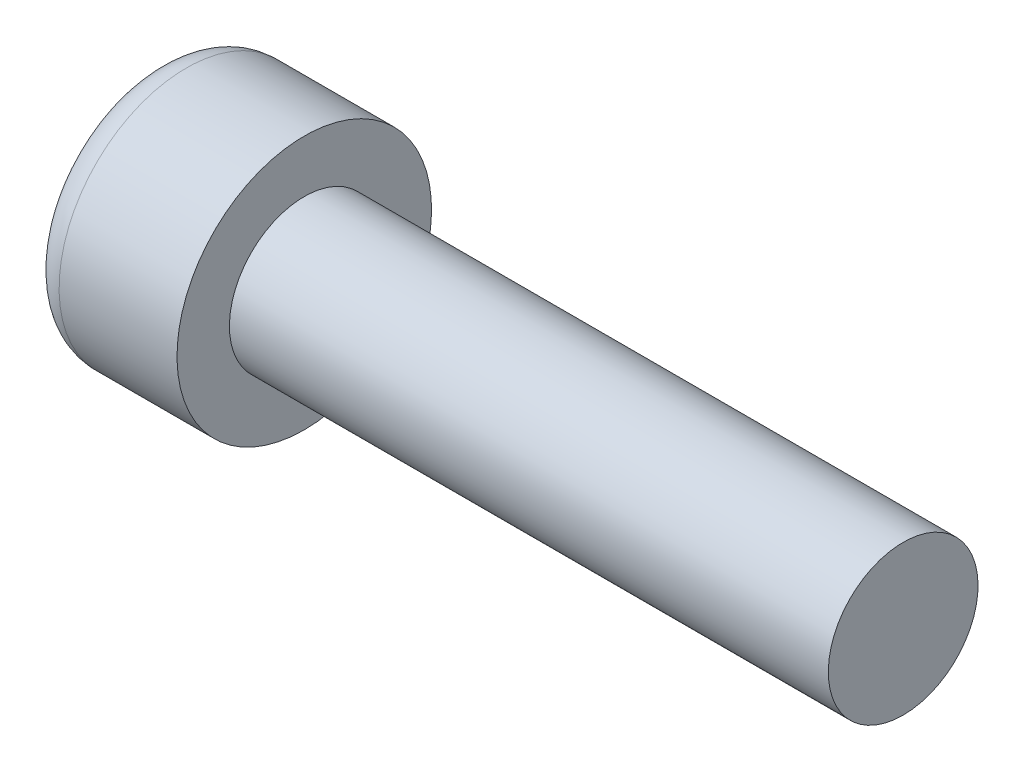
ISO-10303-21;
HEADER;
FILE_DESCRIPTION(('STEP AP214'),'2;1');
FILE_NAME('part.step','',(''),(''),'','','');
FILE_SCHEMA(('AUTOMOTIVE_DESIGN { 1 0 10303 214 1 1 1 1 }'));
ENDSEC;
DATA;
#1=APPLICATION_CONTEXT('core data for automotive mechanical design processes');
#2=APPLICATION_PROTOCOL_DEFINITION('international standard','automotive_design',2000,#1);
#3=PRODUCT_CONTEXT('',#1,'mechanical');
#4=PRODUCT('Part','Part','',(#3));
#5=PRODUCT_RELATED_PRODUCT_CATEGORY('part','',(#4));
#6=PRODUCT_DEFINITION_FORMATION('','',#4);
#7=PRODUCT_DEFINITION_CONTEXT('part definition',#1,'design');
#8=PRODUCT_DEFINITION('design','',#6,#7);
#9=PRODUCT_DEFINITION_SHAPE('','',#8);
#10=(LENGTH_UNIT() NAMED_UNIT(*) SI_UNIT(.MILLI.,.METRE.));
#11=(NAMED_UNIT(*) PLANE_ANGLE_UNIT() SI_UNIT($,.RADIAN.));
#12=(NAMED_UNIT(*) SI_UNIT($,.STERADIAN.) SOLID_ANGLE_UNIT());
#13=UNCERTAINTY_MEASURE_WITH_UNIT(LENGTH_MEASURE(1.E-05),#10,'distance_accuracy_value','');
#14=(GEOMETRIC_REPRESENTATION_CONTEXT(3) GLOBAL_UNCERTAINTY_ASSIGNED_CONTEXT((#13)) GLOBAL_UNIT_ASSIGNED_CONTEXT((#10,
#11,#12)) REPRESENTATION_CONTEXT('',''));
#15=CARTESIAN_POINT('',(0.,0.,0.));
#16=DIRECTION('',(0.,0.,1.));
#17=DIRECTION('',(1.,0.,0.));
#18=AXIS2_PLACEMENT_3D('',#15,#16,#17);
#19=CARTESIAN_POINT('',(0.,0.,0.));
#20=DIRECTION('',(1.,0.,0.));
#21=DIRECTION('',(0.,1.,0.));
#22=AXIS2_PLACEMENT_3D('',#19,#20,#21);
#23=PLANE('',#22);
#24=DIRECTION('',(0.,-0.5,-0.866025403784439));
#25=VECTOR('',#24,1.);
#26=CARTESIAN_POINT('',(0.,2.3094010767585,0.));
#27=LINE('',#26,#25);
#28=CARTESIAN_POINT('',(0.,2.3094010767585,0.));
#29=VERTEX_POINT('',#28);
#30=CARTESIAN_POINT('',(0.,1.15470053837925,-2.));
#31=VERTEX_POINT('',#30);
#32=EDGE_CURVE('E121',#29,#31,#27,.T.);
#33=ORIENTED_EDGE('',*,*,#32,.F.);
#34=DIRECTION('',(0.,0.5,-0.866025403784439));
#35=VECTOR('',#34,1.);
#36=CARTESIAN_POINT('',(0.,1.15470053837925,2.));
#37=LINE('',#36,#35);
#38=CARTESIAN_POINT('',(0.,1.15470053837925,2.));
#39=VERTEX_POINT('',#38);
#40=EDGE_CURVE('E47',#39,#29,#37,.T.);
#41=ORIENTED_EDGE('',*,*,#40,.F.);
#42=DIRECTION('',(0.,1.,0.));
#43=VECTOR('',#42,1.);
#44=CARTESIAN_POINT('',(0.,-1.15470053837925,2.));
#45=LINE('',#44,#43);
#46=CARTESIAN_POINT('',(0.,-1.15470053837925,2.));
#47=VERTEX_POINT('',#46);
#48=EDGE_CURVE('E130',#47,#39,#45,.T.);
#49=ORIENTED_EDGE('',*,*,#48,.F.);
#50=DIRECTION('',(0.,0.5,0.866025403784439));
#51=VECTOR('',#50,1.);
#52=CARTESIAN_POINT('',(0.,-2.3094010767585,0.));
#53=LINE('',#52,#51);
#54=CARTESIAN_POINT('',(0.,-2.3094010767585,0.));
#55=VERTEX_POINT('',#54);
#56=EDGE_CURVE('E128',#55,#47,#53,.T.);
#57=ORIENTED_EDGE('',*,*,#56,.F.);
#58=DIRECTION('',(0.,-0.5,0.866025403784439));
#59=VECTOR('',#58,1.);
#60=CARTESIAN_POINT('',(0.,-1.15470053837925,-2.));
#61=LINE('',#60,#59);
#62=CARTESIAN_POINT('',(0.,-1.15470053837925,-2.));
#63=VERTEX_POINT('',#62);
#64=EDGE_CURVE('E95',#63,#55,#61,.T.);
#65=ORIENTED_EDGE('',*,*,#64,.F.);
#66=DIRECTION('',(0.,-1.,0.));
#67=VECTOR('',#66,1.);
#68=CARTESIAN_POINT('',(0.,1.15470053837925,-2.));
#69=LINE('',#68,#67);
#70=EDGE_CURVE('E124',#31,#63,#69,.T.);
#71=ORIENTED_EDGE('',*,*,#70,.F.);
#72=EDGE_LOOP('',(#33,#41,#49,#57,#65,#71));
#73=FACE_BOUND('',#72,.T.);
#74=CARTESIAN_POINT('',(0.,0.,0.));
#75=DIRECTION('',(-1.,0.,0.));
#76=DIRECTION('',(0.,-1.,0.));
#77=AXIS2_PLACEMENT_3D('',#74,#75,#76);
#78=CIRCLE('',#77,3.1875);
#79=CARTESIAN_POINT('',(0.,-3.1875,0.));
#80=VERTEX_POINT('',#79);
#81=EDGE_CURVE('E11',#80,#80,#78,.T.);
#82=ORIENTED_EDGE('',*,*,#81,.T.);
#83=EDGE_LOOP('',(#82));
#84=FACE_BOUND('',#83,.T.);
#85=ADVANCED_FACE('F33',(#73,#84),#23,.F.);
#86=CARTESIAN_POINT('',(1.0625,0.,0.));
#87=DIRECTION('',(-1.,0.,0.));
#88=DIRECTION('',(0.,-1.,0.));
#89=AXIS2_PLACEMENT_3D('',#86,#87,#88);
#90=TOROIDAL_SURFACE('',#89,3.1875,1.0625);
#91=ORIENTED_EDGE('',*,*,#81,.F.);
#92=EDGE_LOOP('',(#91));
#93=FACE_BOUND('',#92,.T.);
#94=CARTESIAN_POINT('',(1.0625,0.,0.));
#95=DIRECTION('',(-1.,0.,0.));
#96=DIRECTION('',(0.,-1.,0.));
#97=AXIS2_PLACEMENT_3D('',#94,#95,#96);
#98=CIRCLE('',#97,4.25);
#99=CARTESIAN_POINT('',(1.0625,-4.25,0.));
#100=VERTEX_POINT('',#99);
#101=EDGE_CURVE('E40',#100,#100,#98,.T.);
#102=ORIENTED_EDGE('',*,*,#101,.T.);
#103=EDGE_LOOP('',(#102));
#104=FACE_BOUND('',#103,.T.);
#105=ADVANCED_FACE('F150',(#93,#104),#90,.T.);
#106=CARTESIAN_POINT('',(0.,0.,0.));
#107=DIRECTION('',(-1.,0.,0.));
#108=DIRECTION('',(0.,-1.,0.));
#109=AXIS2_PLACEMENT_3D('',#106,#107,#108);
#110=CYLINDRICAL_SURFACE('',#109,4.25);
#111=ORIENTED_EDGE('',*,*,#101,.F.);
#112=EDGE_LOOP('',(#111));
#113=FACE_BOUND('',#112,.T.);
#114=CARTESIAN_POINT('',(5.,0.,0.));
#115=DIRECTION('',(-1.,0.,0.));
#116=DIRECTION('',(0.,-1.,0.));
#117=AXIS2_PLACEMENT_3D('',#114,#115,#116);
#118=CIRCLE('',#117,4.25);
#119=CARTESIAN_POINT('',(5.,-4.25,0.));
#120=VERTEX_POINT('',#119);
#121=EDGE_CURVE('E145',#120,#120,#118,.T.);
#122=ORIENTED_EDGE('',*,*,#121,.T.);
#123=EDGE_LOOP('',(#122));
#124=FACE_BOUND('',#123,.T.);
#125=ADVANCED_FACE('F152',(#113,#124),#110,.T.);
#126=CARTESIAN_POINT('',(5.,4.25,0.));
#127=DIRECTION('',(-1.,0.,0.));
#128=DIRECTION('',(0.,-1.,0.));
#129=AXIS2_PLACEMENT_3D('',#126,#127,#128);
#130=PLANE('',#129);
#131=ORIENTED_EDGE('',*,*,#121,.F.);
#132=EDGE_LOOP('',(#131));
#133=FACE_BOUND('',#132,.T.);
#134=CARTESIAN_POINT('',(5.,0.,0.));
#135=DIRECTION('',(-1.,0.,0.));
#136=DIRECTION('',(0.,-1.,0.));
#137=AXIS2_PLACEMENT_3D('',#134,#135,#136);
#138=CIRCLE('',#137,2.5);
#139=CARTESIAN_POINT('',(5.,-2.5,0.));
#140=VERTEX_POINT('',#139);
#141=EDGE_CURVE('E142',#140,#140,#138,.T.);
#142=ORIENTED_EDGE('',*,*,#141,.T.);
#143=EDGE_LOOP('',(#142));
#144=FACE_BOUND('',#143,.T.);
#145=ADVANCED_FACE('F155',(#133,#144),#130,.F.);
#146=CARTESIAN_POINT('',(0.,0.,0.));
#147=DIRECTION('',(-1.,0.,0.));
#148=DIRECTION('',(0.,-1.,0.));
#149=AXIS2_PLACEMENT_3D('',#146,#147,#148);
#150=CYLINDRICAL_SURFACE('',#149,2.5);
#151=ORIENTED_EDGE('',*,*,#141,.F.);
#152=EDGE_LOOP('',(#151));
#153=FACE_BOUND('',#152,.T.);
#154=CARTESIAN_POINT('',(25.,0.,0.));
#155=DIRECTION('',(-1.,0.,0.));
#156=DIRECTION('',(0.,-1.,0.));
#157=AXIS2_PLACEMENT_3D('',#154,#155,#156);
#158=CIRCLE('',#157,2.49999999999999);
#159=CARTESIAN_POINT('',(25.,-2.49999999999999,0.));
#160=VERTEX_POINT('',#159);
#161=EDGE_CURVE('E134',#160,#160,#158,.T.);
#162=ORIENTED_EDGE('',*,*,#161,.T.);
#163=EDGE_LOOP('',(#162));
#164=FACE_BOUND('',#163,.T.);
#165=ADVANCED_FACE('F161',(#153,#164),#150,.T.);
#166=CARTESIAN_POINT('',(25.,2.5,0.));
#167=DIRECTION('',(-1.,0.,0.));
#168=DIRECTION('',(0.,-1.,0.));
#169=AXIS2_PLACEMENT_3D('',#166,#167,#168);
#170=PLANE('',#169);
#171=ORIENTED_EDGE('',*,*,#161,.F.);
#172=EDGE_LOOP('',(#171));
#173=FACE_BOUND('',#172,.T.);
#174=ADVANCED_FACE('F167',(#173),#170,.F.);
#175=CARTESIAN_POINT('',(2.5,1.15470053837925,2.));
#176=DIRECTION('',(0.,0.866025403784439,0.5));
#177=DIRECTION('',(0.,-0.5,0.866025403784439));
#178=AXIS2_PLACEMENT_3D('',#175,#176,#177);
#179=PLANE('',#178);
#180=ORIENTED_EDGE('',*,*,#40,.T.);
#181=DIRECTION('',(-1.,0.,0.));
#182=VECTOR('',#181,1.);
#183=CARTESIAN_POINT('',(2.5,2.3094010767585,0.));
#184=LINE('',#183,#182);
#185=CARTESIAN_POINT('',(2.5,2.3094010767585,0.));
#186=VERTEX_POINT('',#185);
#187=EDGE_CURVE('E77',#186,#29,#184,.T.);
#188=ORIENTED_EDGE('',*,*,#187,.F.);
#189=DIRECTION('',(0.,0.5,-0.866025403784439));
#190=VECTOR('',#189,1.);
#191=CARTESIAN_POINT('',(2.5,1.15470053837925,2.));
#192=LINE('',#191,#190);
#193=CARTESIAN_POINT('',(2.5,1.15470053837925,2.));
#194=VERTEX_POINT('',#193);
#195=EDGE_CURVE('E132',#194,#186,#192,.T.);
#196=ORIENTED_EDGE('',*,*,#195,.F.);
#197=DIRECTION('',(-1.,0.,0.));
#198=VECTOR('',#197,1.);
#199=CARTESIAN_POINT('',(2.5,1.15470053837925,2.));
#200=LINE('',#199,#198);
#201=EDGE_CURVE('E55',#194,#39,#200,.T.);
#202=ORIENTED_EDGE('',*,*,#201,.T.);
#203=EDGE_LOOP('',(#180,#188,#196,#202));
#204=FACE_BOUND('',#203,.T.);
#205=ADVANCED_FACE('F172',(#204),#179,.F.);
#206=CARTESIAN_POINT('',(2.5,-1.15470053837925,2.));
#207=DIRECTION('',(0.,0.,1.));
#208=DIRECTION('',(1.,0.,0.));
#209=AXIS2_PLACEMENT_3D('',#206,#207,#208);
#210=PLANE('',#209);
#211=ORIENTED_EDGE('',*,*,#48,.T.);
#212=ORIENTED_EDGE('',*,*,#201,.F.);
#213=DIRECTION('',(0.,1.,0.));
#214=VECTOR('',#213,1.);
#215=CARTESIAN_POINT('',(2.5,-1.15470053837925,2.));
#216=LINE('',#215,#214);
#217=CARTESIAN_POINT('',(2.5,-1.15470053837925,2.));
#218=VERTEX_POINT('',#217);
#219=EDGE_CURVE('E107',#218,#194,#216,.T.);
#220=ORIENTED_EDGE('',*,*,#219,.F.);
#221=DIRECTION('',(-1.,0.,0.));
#222=VECTOR('',#221,1.);
#223=CARTESIAN_POINT('',(2.5,-1.15470053837925,2.));
#224=LINE('',#223,#222);
#225=EDGE_CURVE('E99',#218,#47,#224,.T.);
#226=ORIENTED_EDGE('',*,*,#225,.T.);
#227=EDGE_LOOP('',(#211,#212,#220,#226));
#228=FACE_BOUND('',#227,.T.);
#229=ADVANCED_FACE('F177',(#228),#210,.F.);
#230=CARTESIAN_POINT('',(2.5,-2.3094010767585,0.));
#231=DIRECTION('',(0.,-0.866025403784439,0.5));
#232=DIRECTION('',(0.,-0.5,-0.866025403784439));
#233=AXIS2_PLACEMENT_3D('',#230,#231,#232);
#234=PLANE('',#233);
#235=ORIENTED_EDGE('',*,*,#56,.T.);
#236=ORIENTED_EDGE('',*,*,#225,.F.);
#237=DIRECTION('',(0.,0.5,0.866025403784439));
#238=VECTOR('',#237,1.);
#239=CARTESIAN_POINT('',(2.5,-2.3094010767585,0.));
#240=LINE('',#239,#238);
#241=CARTESIAN_POINT('',(2.5,-2.3094010767585,0.));
#242=VERTEX_POINT('',#241);
#243=EDGE_CURVE('E103',#242,#218,#240,.T.);
#244=ORIENTED_EDGE('',*,*,#243,.F.);
#245=DIRECTION('',(-1.,0.,0.));
#246=VECTOR('',#245,1.);
#247=CARTESIAN_POINT('',(2.5,-2.3094010767585,0.));
#248=LINE('',#247,#246);
#249=EDGE_CURVE('E88',#242,#55,#248,.T.);
#250=ORIENTED_EDGE('',*,*,#249,.T.);
#251=EDGE_LOOP('',(#235,#236,#244,#250));
#252=FACE_BOUND('',#251,.T.);
#253=ADVANCED_FACE('F104',(#252),#234,.F.);
#254=CARTESIAN_POINT('',(2.5,-1.15470053837925,-2.));
#255=DIRECTION('',(0.,-0.866025403784438,-0.5));
#256=DIRECTION('',(0.,0.5,-0.866025403784438));
#257=AXIS2_PLACEMENT_3D('',#254,#255,#256);
#258=PLANE('',#257);
#259=ORIENTED_EDGE('',*,*,#64,.T.);
#260=ORIENTED_EDGE('',*,*,#249,.F.);
#261=DIRECTION('',(0.,-0.5,0.866025403784439));
#262=VECTOR('',#261,1.);
#263=CARTESIAN_POINT('',(2.5,-1.15470053837925,-2.));
#264=LINE('',#263,#262);
#265=CARTESIAN_POINT('',(2.5,-1.15470053837925,-2.));
#266=VERTEX_POINT('',#265);
#267=EDGE_CURVE('E92',#266,#242,#264,.T.);
#268=ORIENTED_EDGE('',*,*,#267,.F.);
#269=DIRECTION('',(-1.,0.,0.));
#270=VECTOR('',#269,1.);
#271=CARTESIAN_POINT('',(2.5,-1.15470053837925,-2.));
#272=LINE('',#271,#270);
#273=EDGE_CURVE('E100',#266,#63,#272,.T.);
#274=ORIENTED_EDGE('',*,*,#273,.T.);
#275=EDGE_LOOP('',(#259,#260,#268,#274));
#276=FACE_BOUND('',#275,.T.);
#277=ADVANCED_FACE('F90',(#276),#258,.F.);
#278=CARTESIAN_POINT('',(2.5,1.15470053837925,-2.));
#279=DIRECTION('',(0.,0.,-1.));
#280=DIRECTION('',(-1.,0.,0.));
#281=AXIS2_PLACEMENT_3D('',#278,#279,#280);
#282=PLANE('',#281);
#283=ORIENTED_EDGE('',*,*,#70,.T.);
#284=ORIENTED_EDGE('',*,*,#273,.F.);
#285=DIRECTION('',(0.,-1.,0.));
#286=VECTOR('',#285,1.);
#287=CARTESIAN_POINT('',(2.5,1.15470053837925,-2.));
#288=LINE('',#287,#286);
#289=CARTESIAN_POINT('',(2.5,1.15470053837925,-2.));
#290=VERTEX_POINT('',#289);
#291=EDGE_CURVE('E113',#290,#266,#288,.T.);
#292=ORIENTED_EDGE('',*,*,#291,.F.);
#293=DIRECTION('',(-1.,0.,0.));
#294=VECTOR('',#293,1.);
#295=CARTESIAN_POINT('',(2.5,1.15470053837925,-2.));
#296=LINE('',#295,#294);
#297=EDGE_CURVE('E137',#290,#31,#296,.T.);
#298=ORIENTED_EDGE('',*,*,#297,.T.);
#299=EDGE_LOOP('',(#283,#284,#292,#298));
#300=FACE_BOUND('',#299,.T.);
#301=ADVANCED_FACE('F203',(#300),#282,.F.);
#302=CARTESIAN_POINT('',(2.5,2.3094010767585,0.));
#303=DIRECTION('',(0.,0.866025403784439,-0.5));
#304=DIRECTION('',(0.,0.5,0.866025403784439));
#305=AXIS2_PLACEMENT_3D('',#302,#303,#304);
#306=PLANE('',#305);
#307=ORIENTED_EDGE('',*,*,#32,.T.);
#308=ORIENTED_EDGE('',*,*,#297,.F.);
#309=DIRECTION('',(0.,-0.5,-0.866025403784439));
#310=VECTOR('',#309,1.);
#311=CARTESIAN_POINT('',(2.5,2.3094010767585,0.));
#312=LINE('',#311,#310);
#313=EDGE_CURVE('E115',#186,#290,#312,.T.);
#314=ORIENTED_EDGE('',*,*,#313,.F.);
#315=ORIENTED_EDGE('',*,*,#187,.T.);
#316=EDGE_LOOP('',(#307,#308,#314,#315));
#317=FACE_BOUND('',#316,.T.);
#318=ADVANCED_FACE('F191',(#317),#306,.F.);
#319=CARTESIAN_POINT('',(2.5,0.,0.));
#320=DIRECTION('',(-1.,0.,0.));
#321=DIRECTION('',(0.,-1.,0.));
#322=AXIS2_PLACEMENT_3D('',#319,#320,#321);
#323=PLANE('',#322);
#324=ORIENTED_EDGE('',*,*,#195,.T.);
#325=ORIENTED_EDGE('',*,*,#313,.T.);
#326=ORIENTED_EDGE('',*,*,#291,.T.);
#327=ORIENTED_EDGE('',*,*,#267,.T.);
#328=ORIENTED_EDGE('',*,*,#243,.T.);
#329=ORIENTED_EDGE('',*,*,#219,.T.);
#330=EDGE_LOOP('',(#324,#325,#326,#327,#328,#329));
#331=FACE_BOUND('',#330,.T.);
#332=ADVANCED_FACE('F110',(#331),#323,.T.);
#333=CLOSED_SHELL('',(#85,#105,#125,#145,#165,#174,#205,#229,#253,#277,#301,#318,#332));
#334=MANIFOLD_SOLID_BREP('B2',#333);
#335=ADVANCED_BREP_SHAPE_REPRESENTATION('',(#18,#334),#14);
#336=SHAPE_DEFINITION_REPRESENTATION(#9,#335);
ENDSEC;
END-ISO-10303-21;
